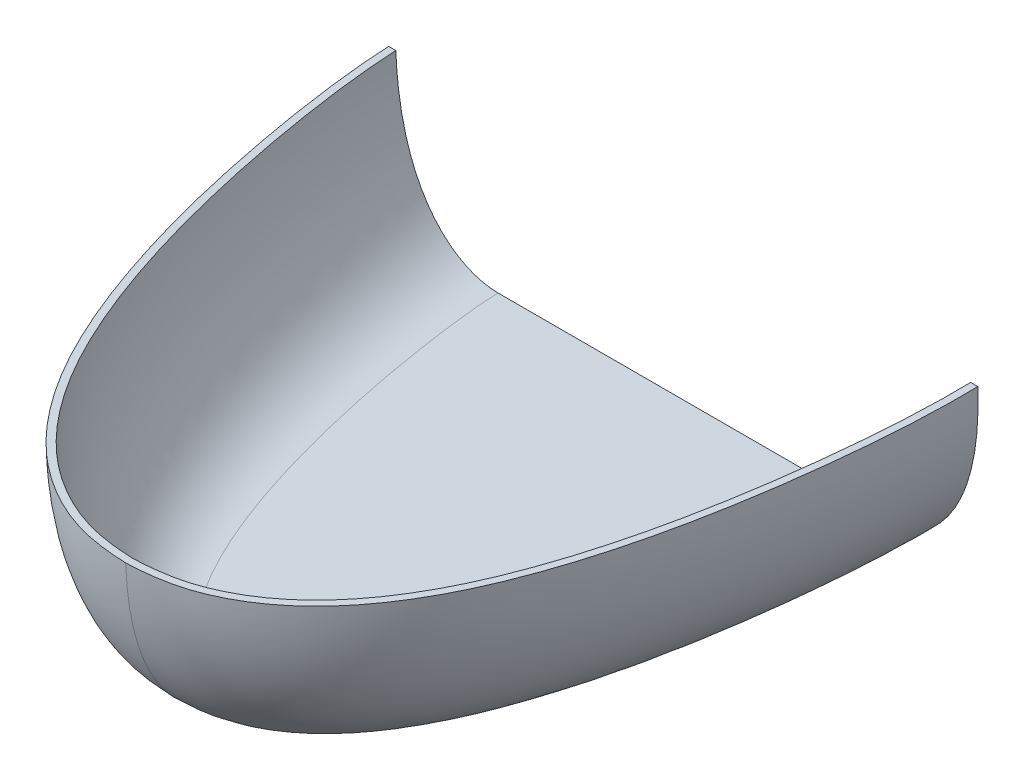
ISO-10303-21;
HEADER;
FILE_DESCRIPTION(('STEP AP214'),'2;1');
FILE_NAME('part.step','',(''),(''),'','','');
FILE_SCHEMA(('AUTOMOTIVE_DESIGN { 1 0 10303 214 1 1 1 1 }'));
ENDSEC;
DATA;
#1=APPLICATION_CONTEXT('core data for automotive mechanical design processes');
#2=APPLICATION_PROTOCOL_DEFINITION('international standard','automotive_design',2000,#1);
#3=PRODUCT_CONTEXT('',#1,'mechanical');
#4=PRODUCT('Part','Part','',(#3));
#5=PRODUCT_RELATED_PRODUCT_CATEGORY('part','',(#4));
#6=PRODUCT_DEFINITION_FORMATION('','',#4);
#7=PRODUCT_DEFINITION_CONTEXT('part definition',#1,'design');
#8=PRODUCT_DEFINITION('design','',#6,#7);
#9=PRODUCT_DEFINITION_SHAPE('','',#8);
#10=(LENGTH_UNIT() NAMED_UNIT(*) SI_UNIT(.MILLI.,.METRE.));
#11=(NAMED_UNIT(*) PLANE_ANGLE_UNIT() SI_UNIT($,.RADIAN.));
#12=(NAMED_UNIT(*) SI_UNIT($,.STERADIAN.) SOLID_ANGLE_UNIT());
#13=UNCERTAINTY_MEASURE_WITH_UNIT(LENGTH_MEASURE(1.E-05),#10,'distance_accuracy_value','');
#14=(GEOMETRIC_REPRESENTATION_CONTEXT(3) GLOBAL_UNCERTAINTY_ASSIGNED_CONTEXT((#13)) GLOBAL_UNIT_ASSIGNED_CONTEXT((#10,
#11,#12)) REPRESENTATION_CONTEXT('',''));
#15=CARTESIAN_POINT('',(0.,0.,0.));
#16=DIRECTION('',(0.,0.,1.));
#17=DIRECTION('',(1.,0.,0.));
#18=AXIS2_PLACEMENT_3D('',#15,#16,#17);
#19=CARTESIAN_POINT('',(54.80914902434,14.2179765991688,55.8740944386488));
#20=DIRECTION('',(0.,-0.0380184346338555,0.999277037976952));
#21=DIRECTION('',(0.,-0.999277037976952,-0.0380184346338555));
#22=AXIS2_PLACEMENT_3D('',#19,#20,#21);
#23=PLANE('',#22);
#24=CARTESIAN_POINT('',(67.9033430898273,6.93788691212751,55.5971165802806));
#25=CARTESIAN_POINT('',(59.652158915195,6.93788691212752,55.5971165802806));
#26=CARTESIAN_POINT('',(47.9033430898269,14.8597734741694,55.8985122043064));
#27=CARTESIAN_POINT('',(47.9033430898273,41.4129447223325,56.9087525751486));
#28=B_SPLINE_CURVE_WITH_KNOTS('',3,(#24,#25,#26,#27),.UNSPECIFIED.,.F.,.F.,(4,4),(0.,1.),.UNSPECIFIED.);
#29=CARTESIAN_POINT('',(67.9033430898273,6.93788691212751,55.5971165802806));
#30=VERTEX_POINT('',#29);
#31=CARTESIAN_POINT('',(47.9033430898273,41.4129447223324,56.9087525751486));
#32=VERTEX_POINT('',#31);
#33=EDGE_CURVE('E188',#30,#32,#28,.T.);
#34=ORIENTED_EDGE('',*,*,#33,.F.);
#35=DIRECTION('',(-1.,0.,0.));
#36=VECTOR('',#35,1.);
#37=CARTESIAN_POINT('',(107.903343089827,6.93788691212751,55.5971165802806));
#38=LINE('',#37,#36);
#39=CARTESIAN_POINT('',(147.903343089827,6.93788691212753,55.5971165802803));
#40=VERTEX_POINT('',#39);
#41=EDGE_CURVE('E113',#40,#30,#38,.T.);
#42=ORIENTED_EDGE('',*,*,#41,.F.);
#43=CARTESIAN_POINT('',(147.903343089827,6.93788691212754,55.5971165802803));
#44=CARTESIAN_POINT('',(156.154527264459,6.93788691212754,55.5971165802802));
#45=CARTESIAN_POINT('',(167.903343089827,14.8597734741694,55.898512204306));
#46=CARTESIAN_POINT('',(167.903343089827,41.4129447223325,56.9087525751482));
#47=B_SPLINE_CURVE_WITH_KNOTS('',3,(#43,#44,#45,#46),.UNSPECIFIED.,.F.,.F.,(4,4),(0.,1.),.UNSPECIFIED.);
#48=CARTESIAN_POINT('',(167.903343089827,41.4129447223324,56.9087525751482));
#49=VERTEX_POINT('',#48);
#50=EDGE_CURVE('E230',#40,#49,#47,.T.);
#51=ORIENTED_EDGE('',*,*,#50,.T.);
#52=DIRECTION('',(1.,0.,0.));
#53=VECTOR('',#52,1.);
#54=CARTESIAN_POINT('',(167.903343089827,41.4129447223324,56.9087525751482));
#55=LINE('',#54,#53);
#56=CARTESIAN_POINT('',(169.403343089827,41.4129447223325,56.9087525751482));
#57=VERTEX_POINT('',#56);
#58=EDGE_CURVE('E208',#49,#57,#55,.T.);
#59=ORIENTED_EDGE('',*,*,#58,.T.);
#60=CARTESIAN_POINT('',(169.403343089827,41.4129447223325,56.9087525751482));
#61=CARTESIAN_POINT('',(169.403343089827,14.6292559291964,55.8897419475279));
#62=CARTESIAN_POINT('',(156.331949818544,5.43897135516211,55.5400889283294));
#63=CARTESIAN_POINT('',(147.903343089827,5.43897135516211,55.5400889283295));
#64=B_SPLINE_CURVE_WITH_KNOTS('',3,(#60,#61,#62,#63),.UNSPECIFIED.,.F.,.F.,(4,4),(0.,1.),.UNSPECIFIED.);
#65=CARTESIAN_POINT('',(147.903343089827,5.4389713551621,55.5400889283295));
#66=VERTEX_POINT('',#65);
#67=EDGE_CURVE('E235',#57,#66,#64,.T.);
#68=ORIENTED_EDGE('',*,*,#67,.T.);
#69=DIRECTION('',(-1.,0.,0.));
#70=VECTOR('',#69,1.);
#71=CARTESIAN_POINT('',(107.903343089827,5.43897135516208,55.5400889283298));
#72=LINE('',#71,#70);
#73=CARTESIAN_POINT('',(67.9033430898273,5.43897135516208,55.5400889283298));
#74=VERTEX_POINT('',#73);
#75=EDGE_CURVE('E138',#66,#74,#72,.T.);
#76=ORIENTED_EDGE('',*,*,#75,.T.);
#77=CARTESIAN_POINT('',(46.4033430898273,41.4129447223325,56.9087525751486));
#78=CARTESIAN_POINT('',(46.4033430898272,14.6292559291964,55.8897419475284));
#79=CARTESIAN_POINT('',(59.4747363611101,5.43897135516209,55.5400889283298));
#80=CARTESIAN_POINT('',(67.9033430898273,5.43897135516209,55.5400889283298));
#81=B_SPLINE_CURVE_WITH_KNOTS('',3,(#77,#78,#79,#80),.UNSPECIFIED.,.F.,.F.,(4,4),(0.,1.),.UNSPECIFIED.);
#82=CARTESIAN_POINT('',(46.4033430898273,41.4129447223325,56.9087525751486));
#83=VERTEX_POINT('',#82);
#84=EDGE_CURVE('E12',#83,#74,#81,.T.);
#85=ORIENTED_EDGE('',*,*,#84,.F.);
#86=DIRECTION('',(-1.,0.,0.));
#87=VECTOR('',#86,1.);
#88=CARTESIAN_POINT('',(47.9033430898273,41.4129447223324,56.9087525751486));
#89=LINE('',#88,#87);
#90=EDGE_CURVE('E85',#32,#83,#89,.T.);
#91=ORIENTED_EDGE('',*,*,#90,.F.);
#92=EDGE_LOOP('',(#34,#42,#51,#59,#68,#76,#85,#91));
#93=FACE_BOUND('',#92,.T.);
#94=ADVANCED_FACE('F72',(#93),#23,.F.);
#95=CARTESIAN_POINT('',(46.4033430898274,41.4129447223325,56.9087525751486));
#96=CARTESIAN_POINT('',(46.4253816349757,41.3039889686236,59.7725470444708));
#97=CARTESIAN_POINT('',(46.772347437222,41.0150316788409,67.3675042650096));
#98=CARTESIAN_POINT('',(48.3995668612818,40.4683699847592,81.7359674513098));
#99=CARTESIAN_POINT('',(51.2593691484672,39.8196801929475,98.7861385057055));
#100=CARTESIAN_POINT('',(55.5771013909224,39.1290918231051,116.937572338356));
#101=CARTESIAN_POINT('',(61.7067184630602,38.4424580458828,134.985063606358));
#102=CARTESIAN_POINT('',(68.6175461031175,37.9259440359548,148.561124664245));
#103=CARTESIAN_POINT('',(75.8102504114116,37.5687105607374,157.950654044382));
#104=CARTESIAN_POINT('',(81.6900275041104,37.3470300616877,163.777307208855));
#105=CARTESIAN_POINT('',(88.9843001872803,37.1555365351753,168.810525588517));
#106=CARTESIAN_POINT('',(97.8940514209302,37.0147504912975,172.510947824981));
#107=CARTESIAN_POINT('',(104.532553996136,36.9892105418198,173.182240194326));
#108=CARTESIAN_POINT('',(107.903343089828,36.9837970874883,173.324527499463));
#109=CARTESIAN_POINT('',(46.4033430898272,14.6292559291964,55.8897419475284));
#110=CARTESIAN_POINT('',(46.4253816349755,14.5203001754876,58.7535364168505));
#111=CARTESIAN_POINT('',(46.7723474372218,14.2313428857048,66.3484936373894));
#112=CARTESIAN_POINT('',(48.3995668612817,13.6846811916232,80.7169568236896));
#113=CARTESIAN_POINT('',(51.259369148467,13.0359913998114,97.7671278780853));
#114=CARTESIAN_POINT('',(55.5771013909223,12.345403029969,115.918561710736));
#115=CARTESIAN_POINT('',(61.70671846306,11.6587692527467,133.966052978738));
#116=CARTESIAN_POINT('',(68.6175461031174,11.1422552428187,147.542114036624));
#117=CARTESIAN_POINT('',(75.8102504114115,10.7850217676013,156.931643416762));
#118=CARTESIAN_POINT('',(81.6900275041103,10.5633412685516,162.758296581235));
#119=CARTESIAN_POINT('',(88.9843001872802,10.3718477420392,167.791514960897));
#120=CARTESIAN_POINT('',(97.8940514209302,10.2310616981614,171.491937197361));
#121=CARTESIAN_POINT('',(104.532553996136,10.2055217486837,172.163229566706));
#122=CARTESIAN_POINT('',(107.903343089828,10.2001082943522,172.305516871843));
#123=CARTESIAN_POINT('',(59.4747363611101,5.43897135516208,55.5400889283298));
#124=CARTESIAN_POINT('',(59.4833760927347,5.34540510770855,57.9993854120079));
#125=CARTESIAN_POINT('',(59.8035442679334,5.08722683043637,64.7853466612592));
#126=CARTESIAN_POINT('',(61.3479457632063,4.56315302587752,78.5601094610541));
#127=CARTESIAN_POINT('',(64.0836389100675,3.94382542861533,94.8385242061586));
#128=CARTESIAN_POINT('',(68.1767866367887,3.28997930379555,112.024224385429));
#129=CARTESIAN_POINT('',(73.8439697515925,2.65675318485932,128.667948057754));
#130=CARTESIAN_POINT('',(79.9178061356651,2.20801406821243,140.462612925622));
#131=CARTESIAN_POINT('',(85.6891307936701,1.9225061988409,147.96690553452));
#132=CARTESIAN_POINT('',(90.1299695419211,1.75594800833719,152.344723213239));
#133=CARTESIAN_POINT('',(95.2983901311616,1.62092404684352,155.893694800227));
#134=CARTESIAN_POINT('',(101.27816406601,1.52785735238623,158.339861026355));
#135=CARTESIAN_POINT('',(105.660591544496,1.50889985784088,158.838140063332));
#136=CARTESIAN_POINT('',(107.903343089827,1.50677763097559,158.893920702285));
#137=CARTESIAN_POINT('',(67.9033430898274,5.43897135516208,55.5400889283298));
#138=CARTESIAN_POINT('',(67.9033430898274,5.35532846425387,57.7385597775255));
#139=CARTESIAN_POINT('',(68.2062318017769,5.11699690007233,64.0028697578122));
#140=CARTESIAN_POINT('',(69.6972312046068,4.60748806450094,77.3948067204001));
#141=CARTESIAN_POINT('',(72.3528971413977,4.00709359742729,93.1755828216034));
#142=CARTESIAN_POINT('',(76.3012298112084,3.37693935664759,109.738565207896));
#143=CARTESIAN_POINT('',(81.6702294130935,2.77815119995855,125.477121025737));
#144=CARTESIAN_POINT('',(87.2043627995087,2.37311422811689,136.123118142427));
#145=CARTESIAN_POINT('',(92.0591631179998,2.13385597510276,142.411785224227));
#146=CARTESIAN_POINT('',(95.5721554492306,2.0028413759417,145.855374678719));
#147=CARTESIAN_POINT('',(99.369798578771,1.90422973452797,148.447284363874));
#148=CARTESIAN_POINT('',(103.460284519361,1.84193310576055,150.084689777069));
#149=CARTESIAN_POINT('',(106.387965028946,1.82722006494579,150.47140753614));
#150=CARTESIAN_POINT('',(107.903343089827,1.82722006494579,150.47140753614));
#151=B_SPLINE_SURFACE_WITH_KNOTS('',3,3,((#95,#96,#97,#98,#99,#100,#101,#102,#103,#104,#105,
#106,#107,#108),(#109,#110,#111,#112,#113,#114,#115,#116,#117,#118,#119,#120,#121,#122),(#123,
#124,#125,#126,#127,#128,#129,#130,#131,#132,#133,#134,#135,#136),(#137,#138,#139,#140,#141,
#142,#143,#144,#145,#146,#147,#148,#149,#150)),.UNSPECIFIED.,.F.,.F.,.F.,(4,4),(4,1,1,1,1,1,1,1,
1,1,1,4),(0.488094480667992,0.971333404254129),(0.,0.125000000000079,0.25,0.375000000000075,0.5,
0.625,0.75,0.8,0.850000000000001,0.9,0.95,1.),.UNSPECIFIED.);
#152=CARTESIAN_POINT('',(67.9033430898274,5.43897135516208,55.5400889283298));
#153=CARTESIAN_POINT('',(67.9033430898274,5.35532846425387,57.7385597775255));
#154=CARTESIAN_POINT('',(68.2062318017769,5.11699690007233,64.0028697578122));
#155=CARTESIAN_POINT('',(69.6972312046068,4.60748806450094,77.3948067204001));
#156=CARTESIAN_POINT('',(72.3528971413977,4.00709359742729,93.1755828216034));
#157=CARTESIAN_POINT('',(76.3012298112084,3.37693935664759,109.738565207896));
#158=CARTESIAN_POINT('',(81.6702294130935,2.77815119995855,125.477121025737));
#159=CARTESIAN_POINT('',(87.2043627995087,2.37311422811689,136.123118142427));
#160=CARTESIAN_POINT('',(92.0591631179998,2.13385597510276,142.411785224227));
#161=CARTESIAN_POINT('',(95.5721554492306,2.0028413759417,145.855374678719));
#162=CARTESIAN_POINT('',(99.369798578771,1.90422973452797,148.447284363874));
#163=CARTESIAN_POINT('',(103.460284519361,1.84193310576055,150.084689777069));
#164=CARTESIAN_POINT('',(106.387965028946,1.82722006494579,150.47140753614));
#165=CARTESIAN_POINT('',(107.903343089827,1.82722006494579,150.47140753614));
#166=B_SPLINE_CURVE_WITH_KNOTS('',3,(#152,#153,#154,#155,#156,#157,#158,#159,#160,#161,#162,
#163,#164,#165),.UNSPECIFIED.,.F.,.F.,(4,1,1,1,1,1,1,1,1,1,1,4),(0.,0.125000000000079,0.25,
0.375000000000075,0.5,0.625,0.75,0.8,0.850000000000001,0.9,0.95,1.),.UNSPECIFIED.);
#167=CARTESIAN_POINT('',(107.903343089827,1.82722006494579,150.47140753614));
#168=VERTEX_POINT('',#167);
#169=EDGE_CURVE('E137',#74,#168,#166,.T.);
#170=CARTESIAN_POINT('',(107.903343089827,36.9837970874883,173.324527499464));
#171=CARTESIAN_POINT('',(107.903343089827,10.2001082943522,172.305516871844));
#172=CARTESIAN_POINT('',(107.903343089827,1.50677763097559,158.893920702285));
#173=CARTESIAN_POINT('',(107.903343089827,1.82722006494579,150.47140753614));
#174=B_SPLINE_CURVE_WITH_KNOTS('',3,(#170,#171,#172,#173),.UNSPECIFIED.,.F.,.F.,(4,4),(0.,1.),.UNSPECIFIED.);
#175=CARTESIAN_POINT('',(107.903343089828,36.9837970874883,173.324527499463));
#176=VERTEX_POINT('',#175);
#177=EDGE_CURVE('E76',#176,#168,#174,.T.);
#178=CARTESIAN_POINT('',(46.4033430898274,41.4129447223325,56.9087525751486));
#179=CARTESIAN_POINT('',(46.4253816349757,41.3039889686236,59.7725470444708));
#180=CARTESIAN_POINT('',(46.772347437222,41.0150316788409,67.3675042650096));
#181=CARTESIAN_POINT('',(48.3995668612818,40.4683699847592,81.7359674513098));
#182=CARTESIAN_POINT('',(51.2593691484672,39.8196801929475,98.7861385057055));
#183=CARTESIAN_POINT('',(55.5771013909224,39.1290918231051,116.937572338356));
#184=CARTESIAN_POINT('',(61.7067184630602,38.4424580458828,134.985063606358));
#185=CARTESIAN_POINT('',(68.6175461031175,37.9259440359548,148.561124664245));
#186=CARTESIAN_POINT('',(75.8102504114116,37.5687105607374,157.950654044382));
#187=CARTESIAN_POINT('',(81.6900275041104,37.3470300616877,163.777307208855));
#188=CARTESIAN_POINT('',(88.9843001872803,37.1555365351753,168.810525588517));
#189=CARTESIAN_POINT('',(97.8940514209302,37.0147504912975,172.510947824981));
#190=CARTESIAN_POINT('',(104.532553996136,36.9892105418198,173.182240194326));
#191=CARTESIAN_POINT('',(107.903343089828,36.9837970874883,173.324527499463));
#192=B_SPLINE_CURVE_WITH_KNOTS('',3,(#178,#179,#180,#181,#182,#183,#184,#185,#186,#187,#188,
#189,#190,#191),.UNSPECIFIED.,.F.,.F.,(4,1,1,1,1,1,1,1,1,1,1,4),(0.,0.125000000000079,0.25,
0.375000000000075,0.5,0.625,0.75,0.8,0.850000000000001,0.9,0.95,1.),.UNSPECIFIED.);
#193=EDGE_CURVE('E152',#83,#176,#192,.T.);
#194=ORIENTED_EDGE('',*,*,#84,.T.);
#195=ORIENTED_EDGE('',*,*,#169,.T.);
#196=ORIENTED_EDGE('',*,*,#177,.F.);
#197=ORIENTED_EDGE('',*,*,#193,.F.);
#198=EDGE_LOOP('',(#194,#195,#196,#197));
#199=FACE_BOUND('',#198,.T.);
#200=ADVANCED_FACE('F147',(#199),#151,.T.);
#201=CARTESIAN_POINT('',(47.9033430898274,41.4129447223324,56.9087525751486));
#202=DIRECTION('',(0.,0.999277037976954,0.0380184346338121));
#203=DIRECTION('',(-1.,0.,0.));
#204=AXIS2_PLACEMENT_3D('',#201,#202,#203);
#205=PLANE('',#204);
#206=ORIENTED_EDGE('',*,*,#90,.T.);
#207=ORIENTED_EDGE('',*,*,#193,.T.);
#208=CARTESIAN_POINT('',(169.403343089826,41.4129447223325,56.9087525751482));
#209=CARTESIAN_POINT('',(169.381304544678,41.3039889686237,59.7725470444703));
#210=CARTESIAN_POINT('',(169.034338742432,41.0150316788409,67.3675042650092));
#211=CARTESIAN_POINT('',(167.407119318372,40.4683699847593,81.7359674513094));
#212=CARTESIAN_POINT('',(164.547317031187,39.8196801929475,98.7861385057052));
#213=CARTESIAN_POINT('',(160.229584788732,39.1290918231051,116.937572338356));
#214=CARTESIAN_POINT('',(154.099967716594,38.4424580458829,134.985063606358));
#215=CARTESIAN_POINT('',(147.189140076537,37.9259440359548,148.561124664244));
#216=CARTESIAN_POINT('',(139.996435768243,37.5687105607374,157.950654044382));
#217=CARTESIAN_POINT('',(134.116658675544,37.3470300616877,163.777307208855));
#218=CARTESIAN_POINT('',(126.822385992374,37.1555365351752,168.810525588517));
#219=CARTESIAN_POINT('',(117.912634758724,37.0147504912975,172.510947824981));
#220=CARTESIAN_POINT('',(111.274132183518,36.9892105418198,173.182240194326));
#221=CARTESIAN_POINT('',(107.903343089827,36.9837970874883,173.324527499463));
#222=B_SPLINE_CURVE_WITH_KNOTS('',3,(#208,#209,#210,#211,#212,#213,#214,#215,#216,#217,#218,
#219,#220,#221),.UNSPECIFIED.,.F.,.F.,(4,1,1,1,1,1,1,1,1,1,1,4),(0.,0.125000000000079,0.25,
0.375000000000075,0.5,0.625,0.75,0.8,0.85,0.9,0.95,1.),.UNSPECIFIED.);
#223=EDGE_CURVE('E143',#57,#176,#222,.T.);
#224=ORIENTED_EDGE('',*,*,#223,.F.);
#225=ORIENTED_EDGE('',*,*,#58,.F.);
#226=CARTESIAN_POINT('',(167.903343089826,41.4129447223325,56.9087525751482));
#227=CARTESIAN_POINT('',(167.882842117595,41.3057549823075,59.7261291174848));
#228=CARTESIAN_POINT('',(167.538951461184,41.0203297198922,67.2282504840525));
#229=CARTESIAN_POINT('',(165.921235759536,40.4762600857067,81.5285839338147));
#230=CARTESIAN_POINT('',(163.075675543308,39.8309397351557,98.4901925496157));
#231=CARTESIAN_POINT('',(158.783715364061,39.1445676998991,116.530804188334));
#232=CARTESIAN_POINT('',(152.707164627057,38.4640626869001,134.417206936558));
#233=CARTESIAN_POINT('',(145.8923854233,37.9553261447455,147.788844928779));
#234=CARTESIAN_POINT('',(138.86279069569,37.6063234989841,156.9620350788));
#235=CARTESIAN_POINT('',(133.148138121234,37.3909685278336,162.622427984437));
#236=CARTESIAN_POINT('',(126.097816337154,37.2059551328397,167.485322501692));
#237=CARTESIAN_POINT('',(117.524292914648,37.0706450946673,171.041813331881));
#238=CARTESIAN_POINT('',(111.144684902159,37.0458605109103,171.69325165865));
#239=CARTESIAN_POINT('',(107.903343089827,37.0408247394391,171.825611942498));
#240=B_SPLINE_CURVE_WITH_KNOTS('',3,(#226,#227,#228,#229,#230,#231,#232,#233,#234,#235,#236,
#237,#238,#239),.UNSPECIFIED.,.F.,.F.,(4,1,1,1,1,1,1,1,1,1,1,4),(0.,0.125000000000079,0.25,
0.375000000000075,0.5,0.625,0.75,0.8,0.85,0.9,0.95,1.),.UNSPECIFIED.);
#241=CARTESIAN_POINT('',(107.903343089828,37.040824739439,171.825611942498));
#242=VERTEX_POINT('',#241);
#243=EDGE_CURVE('E211',#49,#242,#240,.T.);
#244=ORIENTED_EDGE('',*,*,#243,.T.);
#245=CARTESIAN_POINT('',(47.9033430898274,41.4129447223324,56.9087525751486));
#246=CARTESIAN_POINT('',(47.9238440620584,41.3057549823073,59.7261291174852));
#247=CARTESIAN_POINT('',(48.26773471847,41.0203297198921,67.2282504840529));
#248=CARTESIAN_POINT('',(49.8854504201184,40.4762600857065,81.528583933815));
#249=CARTESIAN_POINT('',(52.7310106363461,39.8309397351555,98.490192549616));
#250=CARTESIAN_POINT('',(57.0229708155935,39.1445676998989,116.530804188335));
#251=CARTESIAN_POINT('',(63.0995215525974,38.4640626868999,134.417206936558));
#252=CARTESIAN_POINT('',(69.9143007563541,37.9553261447453,147.788844928779));
#253=CARTESIAN_POINT('',(76.9438954839643,37.606323498984,156.9620350788));
#254=CARTESIAN_POINT('',(82.6585480584211,37.3909685278335,162.622427984437));
#255=CARTESIAN_POINT('',(89.7088698425005,37.2059551328395,167.485322501692));
#256=CARTESIAN_POINT('',(98.2823932650067,37.0706450946671,171.041813331881));
#257=CARTESIAN_POINT('',(104.662001277495,37.0458605109101,171.69325165865));
#258=CARTESIAN_POINT('',(107.903343089828,37.040824739439,171.825611942498));
#259=B_SPLINE_CURVE_WITH_KNOTS('',3,(#245,#246,#247,#248,#249,#250,#251,#252,#253,#254,#255,
#256,#257,#258),.UNSPECIFIED.,.F.,.F.,(4,1,1,1,1,1,1,1,1,1,1,4),(0.,0.125000000000079,0.25,
0.375000000000075,0.5,0.625,0.75,0.8,0.850000000000001,0.9,0.95,1.),.UNSPECIFIED.);
#260=EDGE_CURVE('E103',#32,#242,#259,.T.);
#261=ORIENTED_EDGE('',*,*,#260,.F.);
#262=EDGE_LOOP('',(#206,#207,#224,#225,#244,#261));
#263=FACE_BOUND('',#262,.T.);
#264=ADVANCED_FACE('F74',(#263),#205,.T.);
#265=CARTESIAN_POINT('',(67.9033430898273,6.93788691212751,55.5971165802806));
#266=CARTESIAN_POINT('',(67.9033430898273,6.8542440212193,57.7955874294763));
#267=CARTESIAN_POINT('',(68.2062318017769,6.61591245703776,64.059897409763));
#268=CARTESIAN_POINT('',(69.6972312046068,6.10640362146638,77.4518343723509));
#269=CARTESIAN_POINT('',(72.3528971413978,5.50600915439272,93.2326104735541));
#270=CARTESIAN_POINT('',(76.3012298112084,4.87585491361302,109.795592859847));
#271=CARTESIAN_POINT('',(81.6702294130935,4.27706675692398,125.534148677688));
#272=CARTESIAN_POINT('',(87.2043627995087,3.87202978508232,136.180145794378));
#273=CARTESIAN_POINT('',(92.0591631179998,3.63277153206819,142.468812876178));
#274=CARTESIAN_POINT('',(95.5721554492305,3.50175693290713,145.912402330669));
#275=CARTESIAN_POINT('',(99.369798578771,3.4031452914934,148.504312015825));
#276=CARTESIAN_POINT('',(103.460284519361,3.34084866272598,150.14171742902));
#277=CARTESIAN_POINT('',(106.387965028946,3.32613562191122,150.528435188091));
#278=CARTESIAN_POINT('',(107.903343089827,3.32613562191122,150.528435188091));
#279=CARTESIAN_POINT('',(59.652158915195,6.93788691212751,55.5971165802806));
#280=CARTESIAN_POINT('',(59.6606167800769,6.84452955177952,58.050922672518));
#281=CARTESIAN_POINT('',(59.9804212217902,6.58676904871844,64.8259031388878));
#282=CARTESIAN_POINT('',(61.523698600594,6.06300183741766,78.5926074374388));
#283=CARTESIAN_POINT('',(64.257707171052,5.44407278340503,94.8605468665091));
#284=CARTESIAN_POINT('',(68.3478065342544,4.7907253738193,112.033138807981));
#285=CARTESIAN_POINT('',(74.0087128725812,4.15822417555098,128.657808655898));
#286=CARTESIAN_POINT('',(80.0711884840643,3.71040499103522,140.428294015483));
#287=CARTESIAN_POINT('',(85.8232202631355,3.42587067818657,147.906997651877));
#288=CARTESIAN_POINT('',(90.2445278022075,3.26006068189341,152.265149784086));
#289=CARTESIAN_POINT('',(95.3840934637227,3.12580320138961,155.793975174614));
#290=CARTESIAN_POINT('',(101.324097800566,3.03338421821128,158.223116948933));
#291=CARTESIAN_POINT('',(105.675902789348,3.01451606960955,158.719047615948));
#292=CARTESIAN_POINT('',(107.903343089827,3.01243851571606,158.77365406992));
#293=CARTESIAN_POINT('',(47.9033430898269,14.8597734741694,55.8985122043064));
#294=CARTESIAN_POINT('',(47.9238440620579,14.7525837341443,58.7158887466431));
#295=CARTESIAN_POINT('',(48.2677347184695,14.467158471729,66.2180101132108));
#296=CARTESIAN_POINT('',(49.885450420118,13.9230888375435,80.518343562973));
#297=CARTESIAN_POINT('',(52.7310106363456,13.2777684869925,97.4799521787739));
#298=CARTESIAN_POINT('',(57.0229708155931,12.5913964517359,115.520563817493));
#299=CARTESIAN_POINT('',(63.099521552597,11.9108914387369,133.406966565716));
#300=CARTESIAN_POINT('',(69.9143007563537,11.4021548965823,146.778604557938));
#301=CARTESIAN_POINT('',(76.943895483964,11.053152250821,155.951794707958));
#302=CARTESIAN_POINT('',(82.6585480584208,10.8377972796704,161.612187613596));
#303=CARTESIAN_POINT('',(89.7088698425003,10.6527838846765,166.475082130851));
#304=CARTESIAN_POINT('',(98.2823932650066,10.5174738465041,170.03157296104));
#305=CARTESIAN_POINT('',(104.662001277495,10.4926892627471,170.683011287808));
#306=CARTESIAN_POINT('',(107.903343089827,10.4876534912759,170.815371571656));
#307=CARTESIAN_POINT('',(47.9033430898274,41.4129447223324,56.9087525751486));
#308=CARTESIAN_POINT('',(47.9238440620584,41.3057549823073,59.7261291174852));
#309=CARTESIAN_POINT('',(48.26773471847,41.0203297198921,67.2282504840529));
#310=CARTESIAN_POINT('',(49.8854504201184,40.4762600857065,81.528583933815));
#311=CARTESIAN_POINT('',(52.7310106363461,39.8309397351555,98.490192549616));
#312=CARTESIAN_POINT('',(57.0229708155935,39.1445676998989,116.530804188335));
#313=CARTESIAN_POINT('',(63.0995215525974,38.4640626868999,134.417206936558));
#314=CARTESIAN_POINT('',(69.9143007563541,37.9553261447453,147.788844928779));
#315=CARTESIAN_POINT('',(76.9438954839643,37.606323498984,156.9620350788));
#316=CARTESIAN_POINT('',(82.6585480584211,37.3909685278335,162.622427984437));
#317=CARTESIAN_POINT('',(89.7088698425005,37.2059551328395,167.485322501692));
#318=CARTESIAN_POINT('',(98.2823932650067,37.0706450946671,171.041813331881));
#319=CARTESIAN_POINT('',(104.662001277495,37.0458605109101,171.69325165865));
#320=CARTESIAN_POINT('',(107.903343089828,37.040824739439,171.825611942498));
#321=B_SPLINE_SURFACE_WITH_KNOTS('',3,3,((#265,#266,#267,#268,#269,#270,#271,#272,#273,#274,
#275,#276,#277,#278),(#279,#280,#281,#282,#283,#284,#285,#286,#287,#288,#289,#290,#291,#292),
(#293,#294,#295,#296,#297,#298,#299,#300,#301,#302,#303,#304,#305,#306),(#307,#308,#309,#310,
#311,#312,#313,#314,#315,#316,#317,#318,#319,#320)),.UNSPECIFIED.,.F.,.F.,.F.,(4,4),(4,1,1,1,1,
1,1,1,1,1,1,4),(0.,0.479079860539937),(0.,0.125000000000079,0.25,0.375000000000075,0.5,0.625,
0.75,0.8,0.850000000000001,0.9,0.95,1.),.UNSPECIFIED.);
#322=CARTESIAN_POINT('',(107.903343089827,3.32613562191122,150.528435188091));
#323=CARTESIAN_POINT('',(107.903343089827,3.01243851571606,158.77365406992));
#324=CARTESIAN_POINT('',(107.903343089827,10.4876534912759,170.815371571656));
#325=CARTESIAN_POINT('',(107.903343089827,37.0408247394391,171.825611942498));
#326=B_SPLINE_CURVE_WITH_KNOTS('',3,(#322,#323,#324,#325),.UNSPECIFIED.,.F.,.F.,(4,4),(0.,1.),.UNSPECIFIED.);
#327=CARTESIAN_POINT('',(107.903343089827,3.32613562191123,150.528435188091));
#328=VERTEX_POINT('',#327);
#329=EDGE_CURVE('E157',#328,#242,#326,.T.);
#330=CARTESIAN_POINT('',(67.9033430898273,6.93788691212751,55.5971165802806));
#331=CARTESIAN_POINT('',(67.9033430898273,6.8542440212193,57.7955874294763));
#332=CARTESIAN_POINT('',(68.2062318017769,6.61591245703776,64.059897409763));
#333=CARTESIAN_POINT('',(69.6972312046068,6.10640362146638,77.4518343723509));
#334=CARTESIAN_POINT('',(72.3528971413978,5.50600915439272,93.2326104735541));
#335=CARTESIAN_POINT('',(76.3012298112084,4.87585491361302,109.795592859847));
#336=CARTESIAN_POINT('',(81.6702294130935,4.27706675692398,125.534148677688));
#337=CARTESIAN_POINT('',(87.2043627995087,3.87202978508232,136.180145794378));
#338=CARTESIAN_POINT('',(92.0591631179998,3.63277153206819,142.468812876178));
#339=CARTESIAN_POINT('',(95.5721554492305,3.50175693290713,145.912402330669));
#340=CARTESIAN_POINT('',(99.369798578771,3.4031452914934,148.504312015825));
#341=CARTESIAN_POINT('',(103.460284519361,3.34084866272598,150.14171742902));
#342=CARTESIAN_POINT('',(106.387965028946,3.32613562191122,150.528435188091));
#343=CARTESIAN_POINT('',(107.903343089827,3.32613562191122,150.528435188091));
#344=B_SPLINE_CURVE_WITH_KNOTS('',3,(#330,#331,#332,#333,#334,#335,#336,#337,#338,#339,#340,
#341,#342,#343),.UNSPECIFIED.,.F.,.F.,(4,1,1,1,1,1,1,1,1,1,1,4),(0.,0.125000000000079,0.25,
0.375000000000075,0.5,0.625,0.75,0.8,0.850000000000001,0.9,0.95,1.),.UNSPECIFIED.);
#345=EDGE_CURVE('E151',#30,#328,#344,.T.);
#346=ORIENTED_EDGE('',*,*,#33,.T.);
#347=ORIENTED_EDGE('',*,*,#260,.T.);
#348=ORIENTED_EDGE('',*,*,#329,.F.);
#349=ORIENTED_EDGE('',*,*,#345,.F.);
#350=EDGE_LOOP('',(#346,#347,#348,#349));
#351=FACE_BOUND('',#350,.T.);
#352=ADVANCED_FACE('F253',(#351),#321,.T.);
#353=CARTESIAN_POINT('',(141.768208407903,5.60438644957556,51.192316402341));
#354=DIRECTION('',(0.,-0.999277037976952,-0.0380184346338556));
#355=DIRECTION('',(0.,-0.0380184346338557,0.999277037976952));
#356=AXIS2_PLACEMENT_3D('',#353,#354,#355);
#357=PLANE('',#356);
#358=ORIENTED_EDGE('',*,*,#169,.F.);
#359=ORIENTED_EDGE('',*,*,#75,.F.);
#360=CARTESIAN_POINT('',(147.903343089827,5.43897135516211,55.5400889283295));
#361=CARTESIAN_POINT('',(147.903343089827,5.3553284642539,57.7385597775252));
#362=CARTESIAN_POINT('',(147.600454377877,5.11699690007236,64.002869757812));
#363=CARTESIAN_POINT('',(146.109454975047,4.60748806450098,77.3948067203998));
#364=CARTESIAN_POINT('',(143.453789038256,4.00709359742732,93.1755828216031));
#365=CARTESIAN_POINT('',(139.505456368446,3.37693935664761,109.738565207896));
#366=CARTESIAN_POINT('',(134.136456766561,2.77815119995857,125.477121025737));
#367=CARTESIAN_POINT('',(128.602323380146,2.37311422811691,136.123118142427));
#368=CARTESIAN_POINT('',(123.747523061655,2.13385597510278,142.411785224227));
#369=CARTESIAN_POINT('',(120.234530730424,2.00284137594171,145.855374678718));
#370=CARTESIAN_POINT('',(116.436887600884,1.90422973452798,148.447284363874));
#371=CARTESIAN_POINT('',(112.346401660294,1.84193310576056,150.084689777069));
#372=CARTESIAN_POINT('',(109.418721150708,1.8272200649458,150.47140753614));
#373=CARTESIAN_POINT('',(107.903343089827,1.8272200649458,150.47140753614));
#374=B_SPLINE_CURVE_WITH_KNOTS('',3,(#360,#361,#362,#363,#364,#365,#366,#367,#368,#369,#370,
#371,#372,#373),.UNSPECIFIED.,.F.,.F.,(4,1,1,1,1,1,1,1,1,1,1,4),(0.,0.125000000000079,0.25,
0.375000000000075,0.5,0.625,0.75,0.8,0.85,0.9,0.95,1.),.UNSPECIFIED.);
#375=EDGE_CURVE('E134',#66,#168,#374,.T.);
#376=ORIENTED_EDGE('',*,*,#375,.T.);
#377=EDGE_LOOP('',(#358,#359,#376));
#378=FACE_BOUND('',#377,.T.);
#379=ADVANCED_FACE('F136',(#378),#357,.T.);
#380=CARTESIAN_POINT('',(76.53800763322,4.88108259429489,109.658188431769));
#381=DIRECTION('',(0.,-0.999277037976952,-0.0380184346338555));
#382=DIRECTION('',(0.,0.0380184346338555,-0.999277037976952));
#383=AXIS2_PLACEMENT_3D('',#380,#381,#382);
#384=PLANE('',#383);
#385=ORIENTED_EDGE('',*,*,#345,.T.);
#386=CARTESIAN_POINT('',(147.903343089827,6.93788691212754,55.5971165802803));
#387=CARTESIAN_POINT('',(147.903343089827,6.85424402121933,57.795587429476));
#388=CARTESIAN_POINT('',(147.600454377877,6.61591245703779,64.0598974097627));
#389=CARTESIAN_POINT('',(146.109454975047,6.1064036214664,77.4518343723506));
#390=CARTESIAN_POINT('',(143.453789038256,5.50600915439275,93.2326104735539));
#391=CARTESIAN_POINT('',(139.505456368446,4.87585491361304,109.795592859846));
#392=CARTESIAN_POINT('',(134.136456766561,4.277066756924,125.534148677688));
#393=CARTESIAN_POINT('',(128.602323380146,3.87202978508234,136.180145794378));
#394=CARTESIAN_POINT('',(123.747523061655,3.63277153206821,142.468812876178));
#395=CARTESIAN_POINT('',(120.234530730424,3.50175693290714,145.912402330669));
#396=CARTESIAN_POINT('',(116.436887600884,3.40314529149341,148.504312015825));
#397=CARTESIAN_POINT('',(112.346401660294,3.34084866272599,150.14171742902));
#398=CARTESIAN_POINT('',(109.418721150708,3.32613562191123,150.528435188091));
#399=CARTESIAN_POINT('',(107.903343089827,3.32613562191123,150.528435188091));
#400=B_SPLINE_CURVE_WITH_KNOTS('',3,(#386,#387,#388,#389,#390,#391,#392,#393,#394,#395,#396,
#397,#398,#399),.UNSPECIFIED.,.F.,.F.,(4,1,1,1,1,1,1,1,1,1,1,4),(0.,0.125000000000079,0.25,
0.375000000000075,0.5,0.625,0.75,0.8,0.85,0.9,0.95,1.),.UNSPECIFIED.);
#401=EDGE_CURVE('E144',#40,#328,#400,.T.);
#402=ORIENTED_EDGE('',*,*,#401,.F.);
#403=ORIENTED_EDGE('',*,*,#41,.T.);
#404=EDGE_LOOP('',(#385,#402,#403));
#405=FACE_BOUND('',#404,.T.);
#406=ADVANCED_FACE('F254',(#405),#384,.F.);
#407=CARTESIAN_POINT('',(147.903343089827,5.43897135516211,55.5400889283295));
#408=CARTESIAN_POINT('',(147.903343089827,5.3553284642539,57.7385597775252));
#409=CARTESIAN_POINT('',(147.600454377877,5.11699690007236,64.002869757812));
#410=CARTESIAN_POINT('',(146.109454975047,4.60748806450098,77.3948067203998));
#411=CARTESIAN_POINT('',(143.453789038256,4.00709359742732,93.1755828216031));
#412=CARTESIAN_POINT('',(139.505456368446,3.37693935664761,109.738565207896));
#413=CARTESIAN_POINT('',(134.136456766561,2.77815119995857,125.477121025737));
#414=CARTESIAN_POINT('',(128.602323380146,2.37311422811691,136.123118142427));
#415=CARTESIAN_POINT('',(123.747523061655,2.13385597510278,142.411785224227));
#416=CARTESIAN_POINT('',(120.234530730424,2.00284137594171,145.855374678718));
#417=CARTESIAN_POINT('',(116.436887600884,1.90422973452798,148.447284363874));
#418=CARTESIAN_POINT('',(112.346401660294,1.84193310576056,150.084689777069));
#419=CARTESIAN_POINT('',(109.418721150708,1.8272200649458,150.47140753614));
#420=CARTESIAN_POINT('',(107.903343089827,1.8272200649458,150.47140753614));
#421=CARTESIAN_POINT('',(156.331949818544,5.43897135516211,55.5400889283294));
#422=CARTESIAN_POINT('',(156.323310086919,5.34540510770858,57.9993854120076));
#423=CARTESIAN_POINT('',(156.003141911721,5.0872268304364,64.7853466612589));
#424=CARTESIAN_POINT('',(154.458740416448,4.56315302587756,78.5601094610537));
#425=CARTESIAN_POINT('',(151.723047269587,3.94382542861536,94.8385242061584));
#426=CARTESIAN_POINT('',(147.629899542866,3.28997930379558,112.024224385428));
#427=CARTESIAN_POINT('',(141.962716428062,2.65675318485934,128.667948057753));
#428=CARTESIAN_POINT('',(135.888880043989,2.20801406821245,140.462612925622));
#429=CARTESIAN_POINT('',(130.117555385984,1.92250619884092,147.966905534519));
#430=CARTESIAN_POINT('',(125.676716637733,1.75594800833721,152.344723213239));
#431=CARTESIAN_POINT('',(120.508296048493,1.62092404684353,155.893694800227));
#432=CARTESIAN_POINT('',(114.528522113645,1.52785735238624,158.339861026355));
#433=CARTESIAN_POINT('',(110.146094635158,1.50889985784089,158.838140063332));
#434=CARTESIAN_POINT('',(107.903343089827,1.50677763097559,158.893920702285));
#435=CARTESIAN_POINT('',(169.403343089827,14.6292559291964,55.8897419475279));
#436=CARTESIAN_POINT('',(169.381304544678,14.5203001754876,58.7535364168501));
#437=CARTESIAN_POINT('',(169.034338742432,14.2313428857048,66.348493637389));
#438=CARTESIAN_POINT('',(167.407119318372,13.6846811916232,80.7169568236892));
#439=CARTESIAN_POINT('',(164.547317031187,13.0359913998114,97.767127878085));
#440=CARTESIAN_POINT('',(160.229584788732,12.345403029969,115.918561710736));
#441=CARTESIAN_POINT('',(154.099967716594,11.6587692527468,133.966052978738));
#442=CARTESIAN_POINT('',(147.189140076537,11.1422552428187,147.542114036624));
#443=CARTESIAN_POINT('',(139.996435768243,10.7850217676014,156.931643416762));
#444=CARTESIAN_POINT('',(134.116658675544,10.5633412685516,162.758296581235));
#445=CARTESIAN_POINT('',(126.822385992374,10.3718477420392,167.791514960897));
#446=CARTESIAN_POINT('',(117.912634758724,10.2310616981614,171.491937197361));
#447=CARTESIAN_POINT('',(111.274132183518,10.2055217486837,172.163229566706));
#448=CARTESIAN_POINT('',(107.903343089827,10.2001082943522,172.305516871843));
#449=CARTESIAN_POINT('',(169.403343089826,41.4129447223325,56.9087525751482));
#450=CARTESIAN_POINT('',(169.381304544678,41.3039889686237,59.7725470444703));
#451=CARTESIAN_POINT('',(169.034338742432,41.0150316788409,67.3675042650092));
#452=CARTESIAN_POINT('',(167.407119318372,40.4683699847593,81.7359674513094));
#453=CARTESIAN_POINT('',(164.547317031187,39.8196801929475,98.7861385057052));
#454=CARTESIAN_POINT('',(160.229584788732,39.1290918231051,116.937572338356));
#455=CARTESIAN_POINT('',(154.099967716594,38.4424580458829,134.985063606358));
#456=CARTESIAN_POINT('',(147.189140076537,37.9259440359548,148.561124664244));
#457=CARTESIAN_POINT('',(139.996435768243,37.5687105607374,157.950654044382));
#458=CARTESIAN_POINT('',(134.116658675544,37.3470300616877,163.777307208855));
#459=CARTESIAN_POINT('',(126.822385992374,37.1555365351752,168.810525588517));
#460=CARTESIAN_POINT('',(117.912634758724,37.0147504912975,172.510947824981));
#461=CARTESIAN_POINT('',(111.274132183518,36.9892105418198,173.182240194326));
#462=CARTESIAN_POINT('',(107.903343089827,36.9837970874883,173.324527499463));
#463=B_SPLINE_SURFACE_WITH_KNOTS('',3,3,((#407,#408,#409,#410,#411,#412,#413,#414,#415,#416,
#417,#418,#419,#420),(#421,#422,#423,#424,#425,#426,#427,#428,#429,#430,#431,#432,#433,#434),
(#435,#436,#437,#438,#439,#440,#441,#442,#443,#444,#445,#446,#447,#448),(#449,#450,#451,#452,
#453,#454,#455,#456,#457,#458,#459,#460,#461,#462)),.UNSPECIFIED.,.F.,.F.,.F.,(4,4),(4,1,1,1,1,
1,1,1,1,1,1,4),(0.504768561192326,0.990930845794148),(0.,0.125000000000079,0.25,
0.375000000000075,0.5,0.625,0.75,0.8,0.85,0.9,0.95,1.),.UNSPECIFIED.);
#464=ORIENTED_EDGE('',*,*,#67,.F.);
#465=ORIENTED_EDGE('',*,*,#223,.T.);
#466=ORIENTED_EDGE('',*,*,#177,.T.);
#467=ORIENTED_EDGE('',*,*,#375,.F.);
#468=EDGE_LOOP('',(#464,#465,#466,#467));
#469=FACE_BOUND('',#468,.T.);
#470=ADVANCED_FACE('F155',(#469),#463,.T.);
#471=CARTESIAN_POINT('',(167.903343089826,41.4129447223325,56.9087525751482));
#472=CARTESIAN_POINT('',(167.882842117595,41.3057549823075,59.7261291174848));
#473=CARTESIAN_POINT('',(167.538951461184,41.0203297198922,67.2282504840525));
#474=CARTESIAN_POINT('',(165.921235759536,40.4762600857067,81.5285839338147));
#475=CARTESIAN_POINT('',(163.075675543308,39.8309397351557,98.4901925496157));
#476=CARTESIAN_POINT('',(158.783715364061,39.1445676998991,116.530804188334));
#477=CARTESIAN_POINT('',(152.707164627057,38.4640626869001,134.417206936558));
#478=CARTESIAN_POINT('',(145.8923854233,37.9553261447455,147.788844928779));
#479=CARTESIAN_POINT('',(138.86279069569,37.6063234989841,156.9620350788));
#480=CARTESIAN_POINT('',(133.148138121234,37.3909685278336,162.622427984437));
#481=CARTESIAN_POINT('',(126.097816337154,37.2059551328397,167.485322501692));
#482=CARTESIAN_POINT('',(117.524292914648,37.0706450946673,171.041813331881));
#483=CARTESIAN_POINT('',(111.144684902159,37.0458605109103,171.69325165865));
#484=CARTESIAN_POINT('',(107.903343089827,37.0408247394391,171.825611942498));
#485=CARTESIAN_POINT('',(167.903343089827,14.8597734741694,55.898512204306));
#486=CARTESIAN_POINT('',(167.882842117596,14.7525837341443,58.7158887466426));
#487=CARTESIAN_POINT('',(167.538951461184,14.4671584717291,66.2180101132105));
#488=CARTESIAN_POINT('',(165.921235759536,13.9230888375435,80.5183435629726));
#489=CARTESIAN_POINT('',(163.075675543308,13.2777684869925,97.4799521787736));
#490=CARTESIAN_POINT('',(158.783715364061,12.5913964517359,115.520563817493));
#491=CARTESIAN_POINT('',(152.707164627057,11.9108914387369,133.406966565716));
#492=CARTESIAN_POINT('',(145.892385423301,11.4021548965823,146.778604557937));
#493=CARTESIAN_POINT('',(138.862790695691,11.053152250821,155.951794707958));
#494=CARTESIAN_POINT('',(133.148138121234,10.8377972796705,161.612187613596));
#495=CARTESIAN_POINT('',(126.097816337154,10.6527838846765,166.47508213085));
#496=CARTESIAN_POINT('',(117.524292914648,10.5174738465041,170.03157296104));
#497=CARTESIAN_POINT('',(111.144684902159,10.4926892627471,170.683011287808));
#498=CARTESIAN_POINT('',(107.903343089827,10.487653491276,170.815371571656));
#499=CARTESIAN_POINT('',(156.154527264459,6.93788691212754,55.5971165802802));
#500=CARTESIAN_POINT('',(156.146069399577,6.84452955177956,58.0509226725176));
#501=CARTESIAN_POINT('',(155.826264957864,6.58676904871848,64.8259031388875));
#502=CARTESIAN_POINT('',(154.28298757906,6.0630018374177,78.5926074374385));
#503=CARTESIAN_POINT('',(151.548979008602,5.44407278340506,94.8605468665088));
#504=CARTESIAN_POINT('',(147.4588796454,4.79072537381933,112.033138807981));
#505=CARTESIAN_POINT('',(141.797973307073,4.15822417555101,128.657808655897));
#506=CARTESIAN_POINT('',(135.73549769559,3.71040499103524,140.428294015483));
#507=CARTESIAN_POINT('',(129.983465916519,3.4258706781866,147.906997651877));
#508=CARTESIAN_POINT('',(125.562158377447,3.26006068189343,152.265149784086));
#509=CARTESIAN_POINT('',(120.422592715932,3.12580320138963,155.793975174614));
#510=CARTESIAN_POINT('',(114.482588379089,3.03338421821129,158.223116948932));
#511=CARTESIAN_POINT('',(110.130783390306,3.01451606960956,158.719047615948));
#512=CARTESIAN_POINT('',(107.903343089827,3.01243851571607,158.77365406992));
#513=CARTESIAN_POINT('',(147.903343089827,6.93788691212754,55.5971165802803));
#514=CARTESIAN_POINT('',(147.903343089827,6.85424402121933,57.795587429476));
#515=CARTESIAN_POINT('',(147.600454377877,6.61591245703779,64.0598974097627));
#516=CARTESIAN_POINT('',(146.109454975047,6.1064036214664,77.4518343723506));
#517=CARTESIAN_POINT('',(143.453789038256,5.50600915439275,93.2326104735539));
#518=CARTESIAN_POINT('',(139.505456368446,4.87585491361304,109.795592859846));
#519=CARTESIAN_POINT('',(134.136456766561,4.277066756924,125.534148677688));
#520=CARTESIAN_POINT('',(128.602323380146,3.87202978508234,136.180145794378));
#521=CARTESIAN_POINT('',(123.747523061655,3.63277153206821,142.468812876178));
#522=CARTESIAN_POINT('',(120.234530730424,3.50175693290714,145.912402330669));
#523=CARTESIAN_POINT('',(116.436887600884,3.40314529149341,148.504312015825));
#524=CARTESIAN_POINT('',(112.346401660294,3.34084866272599,150.14171742902));
#525=CARTESIAN_POINT('',(109.418721150708,3.32613562191123,150.528435188091));
#526=CARTESIAN_POINT('',(107.903343089827,3.32613562191123,150.528435188091));
#527=B_SPLINE_SURFACE_WITH_KNOTS('',3,3,((#471,#472,#473,#474,#475,#476,#477,#478,#479,#480,
#481,#482,#483,#484),(#485,#486,#487,#488,#489,#490,#491,#492,#493,#494,#495,#496,#497,#498),
(#499,#500,#501,#502,#503,#504,#505,#506,#507,#508,#509,#510,#511,#512),(#513,#514,#515,#516,
#517,#518,#519,#520,#521,#522,#523,#524,#525,#526)),.UNSPECIFIED.,.F.,.F.,.F.,(4,4),(4,1,1,1,1,
1,1,1,1,1,1,4),(0.,0.47592854645149),(0.,0.125000000000079,0.25,0.375000000000075,0.5,0.625,
0.75,0.8,0.85,0.9,0.95,1.),.UNSPECIFIED.);
#528=ORIENTED_EDGE('',*,*,#50,.F.);
#529=ORIENTED_EDGE('',*,*,#401,.T.);
#530=ORIENTED_EDGE('',*,*,#329,.T.);
#531=ORIENTED_EDGE('',*,*,#243,.F.);
#532=EDGE_LOOP('',(#528,#529,#530,#531));
#533=FACE_BOUND('',#532,.T.);
#534=ADVANCED_FACE('F251',(#533),#527,.T.);
#535=CLOSED_SHELL('',(#94,#200,#264,#352,#379,#406,#470,#534));
#536=MANIFOLD_SOLID_BREP('B2',#535);
#537=ADVANCED_BREP_SHAPE_REPRESENTATION('',(#18,#536),#14);
#538=SHAPE_DEFINITION_REPRESENTATION(#9,#537);
ENDSEC;
END-ISO-10303-21;
